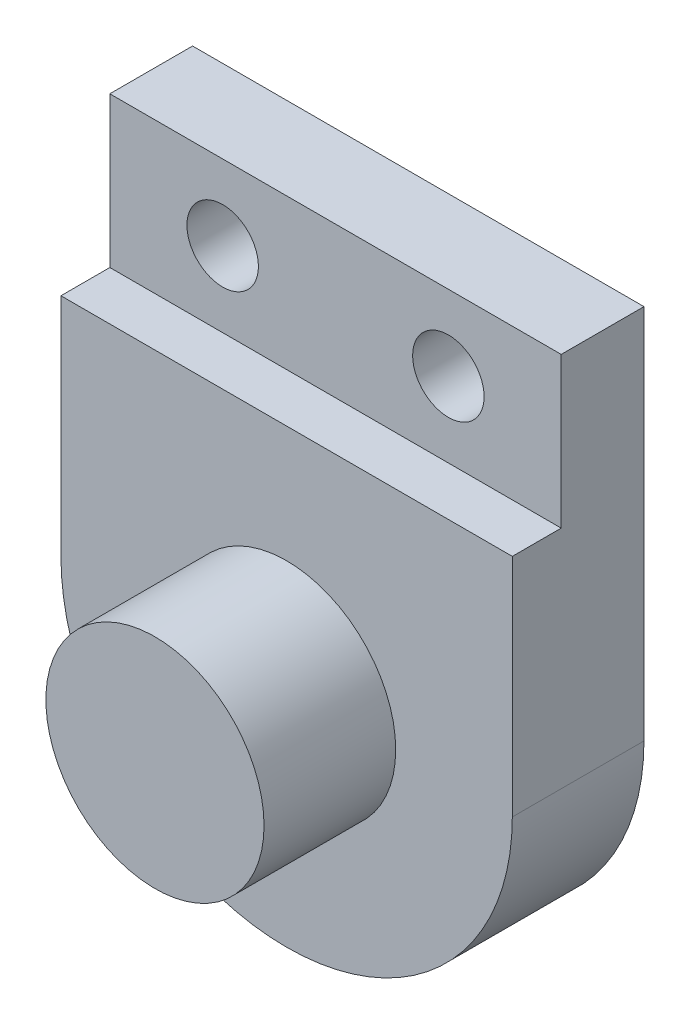
ISO-10303-21;
HEADER;
FILE_DESCRIPTION(('STEP AP214'),'2;1');
FILE_NAME('part.step','',(''),(''),'','','');
FILE_SCHEMA(('AUTOMOTIVE_DESIGN { 1 0 10303 214 1 1 1 1 }'));
ENDSEC;
DATA;
#1=APPLICATION_CONTEXT('core data for automotive mechanical design processes');
#2=APPLICATION_PROTOCOL_DEFINITION('international standard','automotive_design',2000,#1);
#3=PRODUCT_CONTEXT('',#1,'mechanical');
#4=PRODUCT('Part','Part','',(#3));
#5=PRODUCT_RELATED_PRODUCT_CATEGORY('part','',(#4));
#6=PRODUCT_DEFINITION_FORMATION('','',#4);
#7=PRODUCT_DEFINITION_CONTEXT('part definition',#1,'design');
#8=PRODUCT_DEFINITION('design','',#6,#7);
#9=PRODUCT_DEFINITION_SHAPE('','',#8);
#10=(LENGTH_UNIT() NAMED_UNIT(*) SI_UNIT(.MILLI.,.METRE.));
#11=(NAMED_UNIT(*) PLANE_ANGLE_UNIT() SI_UNIT($,.RADIAN.));
#12=(NAMED_UNIT(*) SI_UNIT($,.STERADIAN.) SOLID_ANGLE_UNIT());
#13=UNCERTAINTY_MEASURE_WITH_UNIT(LENGTH_MEASURE(1.E-05),#10,'distance_accuracy_value','');
#14=(GEOMETRIC_REPRESENTATION_CONTEXT(3) GLOBAL_UNCERTAINTY_ASSIGNED_CONTEXT((#13)) GLOBAL_UNIT_ASSIGNED_CONTEXT((#10,
#11,#12)) REPRESENTATION_CONTEXT('',''));
#15=CARTESIAN_POINT('',(0.,0.,0.));
#16=DIRECTION('',(0.,0.,1.));
#17=DIRECTION('',(1.,0.,0.));
#18=AXIS2_PLACEMENT_3D('',#15,#16,#17);
#19=CARTESIAN_POINT('',(3.,2.,2.2));
#20=DIRECTION('',(0.,0.,-1.));
#21=DIRECTION('',(-1.,0.,0.));
#22=AXIS2_PLACEMENT_3D('',#19,#20,#21);
#23=CYLINDRICAL_SURFACE('',#22,0.95);
#24=CARTESIAN_POINT('',(3.,2.,2.2));
#25=DIRECTION('',(0.,0.,1.));
#26=DIRECTION('',(1.,0.,0.));
#27=AXIS2_PLACEMENT_3D('',#24,#25,#26);
#28=CIRCLE('',#27,0.95);
#29=CARTESIAN_POINT('',(3.95,2.,2.2));
#30=VERTEX_POINT('',#29);
#31=EDGE_CURVE('E151',#30,#30,#28,.T.);
#32=ORIENTED_EDGE('',*,*,#31,.T.);
#33=EDGE_LOOP('',(#32));
#34=FACE_BOUND('',#33,.T.);
#35=CARTESIAN_POINT('',(3.,2.,0.3));
#36=DIRECTION('',(0.,0.,-1.));
#37=DIRECTION('',(-1.,0.,0.));
#38=AXIS2_PLACEMENT_3D('',#35,#36,#37);
#39=CIRCLE('',#38,0.95);
#40=CARTESIAN_POINT('',(2.05,2.,0.3));
#41=VERTEX_POINT('',#40);
#42=EDGE_CURVE('E167',#41,#41,#39,.T.);
#43=ORIENTED_EDGE('',*,*,#42,.T.);
#44=EDGE_LOOP('',(#43));
#45=FACE_BOUND('',#44,.T.);
#46=ADVANCED_FACE('F37',(#34,#45),#23,.F.);
#47=CARTESIAN_POINT('',(9.,2.,2.2));
#48=DIRECTION('',(0.,0.,-1.));
#49=DIRECTION('',(-1.,0.,0.));
#50=AXIS2_PLACEMENT_3D('',#47,#48,#49);
#51=CYLINDRICAL_SURFACE('',#50,0.949999999999999);
#52=CARTESIAN_POINT('',(9.,2.,2.2));
#53=DIRECTION('',(0.,0.,1.));
#54=DIRECTION('',(1.,0.,0.));
#55=AXIS2_PLACEMENT_3D('',#52,#53,#54);
#56=CIRCLE('',#55,0.949999999999999);
#57=CARTESIAN_POINT('',(9.95,2.,2.2));
#58=VERTEX_POINT('',#57);
#59=EDGE_CURVE('E148',#58,#58,#56,.T.);
#60=ORIENTED_EDGE('',*,*,#59,.T.);
#61=EDGE_LOOP('',(#60));
#62=FACE_BOUND('',#61,.T.);
#63=CARTESIAN_POINT('',(9.,2.,0.3));
#64=DIRECTION('',(0.,0.,-1.));
#65=DIRECTION('',(-1.,0.,0.));
#66=AXIS2_PLACEMENT_3D('',#63,#64,#65);
#67=CIRCLE('',#66,0.949999999999999);
#68=CARTESIAN_POINT('',(8.05,2.,0.3));
#69=VERTEX_POINT('',#68);
#70=EDGE_CURVE('E138',#69,#69,#67,.T.);
#71=ORIENTED_EDGE('',*,*,#70,.T.);
#72=EDGE_LOOP('',(#71));
#73=FACE_BOUND('',#72,.T.);
#74=ADVANCED_FACE('F241',(#62,#73),#51,.F.);
#75=CARTESIAN_POINT('',(12.,0.,3.));
#76=DIRECTION('',(1.,0.,0.));
#77=DIRECTION('',(0.,0.,-1.));
#78=AXIS2_PLACEMENT_3D('',#75,#76,#77);
#79=PLANE('',#78);
#80=DIRECTION('',(0.,-1.,0.));
#81=VECTOR('',#80,1.);
#82=CARTESIAN_POINT('',(12.,0.,0.));
#83=LINE('',#82,#81);
#84=CARTESIAN_POINT('',(12.,4.,0.));
#85=VERTEX_POINT('',#84);
#86=CARTESIAN_POINT('',(12.,-6.,0.));
#87=VERTEX_POINT('',#86);
#88=EDGE_CURVE('E178',#85,#87,#83,.T.);
#89=ORIENTED_EDGE('',*,*,#88,.F.);
#90=DIRECTION('',(0.,0.,-1.));
#91=VECTOR('',#90,1.);
#92=CARTESIAN_POINT('',(12.,4.,2.2));
#93=LINE('',#92,#91);
#94=CARTESIAN_POINT('',(12.,4.,2.2));
#95=VERTEX_POINT('',#94);
#96=EDGE_CURVE('E164',#95,#85,#93,.T.);
#97=ORIENTED_EDGE('',*,*,#96,.F.);
#98=DIRECTION('',(0.,1.,0.));
#99=VECTOR('',#98,1.);
#100=CARTESIAN_POINT('',(12.,0.,2.2));
#101=LINE('',#100,#99);
#102=CARTESIAN_POINT('',(12.,0.,2.2));
#103=VERTEX_POINT('',#102);
#104=EDGE_CURVE('E162',#103,#95,#101,.T.);
#105=ORIENTED_EDGE('',*,*,#104,.F.);
#106=DIRECTION('',(0.,0.,-1.));
#107=VECTOR('',#106,1.);
#108=CARTESIAN_POINT('',(12.,0.,3.));
#109=LINE('',#108,#107);
#110=CARTESIAN_POINT('',(12.,0.,3.5));
#111=VERTEX_POINT('',#110);
#112=EDGE_CURVE('E46',#111,#103,#109,.T.);
#113=ORIENTED_EDGE('',*,*,#112,.F.);
#114=DIRECTION('',(-6.94443962403867E-07,0.999999999999759,0.));
#115=VECTOR('',#114,1.);
#116=CARTESIAN_POINT('',(12.,0.,3.5));
#117=LINE('',#116,#115);
#118=CARTESIAN_POINT('',(12.0000041666638,-6.,3.5));
#119=VERTEX_POINT('',#118);
#120=EDGE_CURVE('E122',#119,#111,#117,.T.);
#121=ORIENTED_EDGE('',*,*,#120,.F.);
#122=DIRECTION('',(0.,0.,-1.));
#123=VECTOR('',#122,1.);
#124=CARTESIAN_POINT('',(12.,-6.,3.));
#125=LINE('',#124,#123);
#126=EDGE_CURVE('E11',#119,#87,#125,.T.);
#127=ORIENTED_EDGE('',*,*,#126,.T.);
#128=EDGE_LOOP('',(#89,#97,#105,#113,#121,#127));
#129=FACE_BOUND('',#128,.T.);
#130=ADVANCED_FACE('F39',(#129),#79,.T.);
#131=CARTESIAN_POINT('',(0.,0.,3.));
#132=DIRECTION('',(0.,1.,0.));
#133=DIRECTION('',(0.,0.,1.));
#134=AXIS2_PLACEMENT_3D('',#131,#132,#133);
#135=PLANE('',#134);
#136=DIRECTION('',(1.,0.,0.));
#137=VECTOR('',#136,1.);
#138=CARTESIAN_POINT('',(0.,0.,2.2));
#139=LINE('',#138,#137);
#140=CARTESIAN_POINT('',(0.,0.,2.2));
#141=VERTEX_POINT('',#140);
#142=EDGE_CURVE('E54',#141,#103,#139,.T.);
#143=ORIENTED_EDGE('',*,*,#142,.F.);
#144=DIRECTION('',(0.,0.,-1.));
#145=VECTOR('',#144,1.);
#146=CARTESIAN_POINT('',(0.,0.,3.));
#147=LINE('',#146,#145);
#148=CARTESIAN_POINT('',(0.,0.,3.5));
#149=VERTEX_POINT('',#148);
#150=EDGE_CURVE('E113',#149,#141,#147,.T.);
#151=ORIENTED_EDGE('',*,*,#150,.F.);
#152=DIRECTION('',(-1.,0.,0.));
#153=VECTOR('',#152,1.);
#154=CARTESIAN_POINT('',(0.,0.,3.5));
#155=LINE('',#154,#153);
#156=EDGE_CURVE('E127',#111,#149,#155,.T.);
#157=ORIENTED_EDGE('',*,*,#156,.F.);
#158=ORIENTED_EDGE('',*,*,#112,.T.);
#159=EDGE_LOOP('',(#143,#151,#157,#158));
#160=FACE_BOUND('',#159,.T.);
#161=ADVANCED_FACE('F223',(#160),#135,.T.);
#162=CARTESIAN_POINT('',(0.,0.,3.));
#163=DIRECTION('',(-1.,0.,0.));
#164=DIRECTION('',(0.,-1.,0.));
#165=AXIS2_PLACEMENT_3D('',#162,#163,#164);
#166=PLANE('',#165);
#167=DIRECTION('',(0.,1.,0.));
#168=VECTOR('',#167,1.);
#169=CARTESIAN_POINT('',(0.,0.,0.));
#170=LINE('',#169,#168);
#171=CARTESIAN_POINT('',(0.,-5.99999999999996,0.));
#172=VERTEX_POINT('',#171);
#173=CARTESIAN_POINT('',(0.,4.,0.));
#174=VERTEX_POINT('',#173);
#175=EDGE_CURVE('E110',#172,#174,#170,.T.);
#176=ORIENTED_EDGE('',*,*,#175,.F.);
#177=DIRECTION('',(0.,0.,-1.));
#178=VECTOR('',#177,1.);
#179=CARTESIAN_POINT('',(0.,-5.99999999999996,3.));
#180=LINE('',#179,#178);
#181=CARTESIAN_POINT('',(-2.08333188547738E-06,-5.99999999999996,3.5));
#182=VERTEX_POINT('',#181);
#183=EDGE_CURVE('E104',#182,#172,#180,.T.);
#184=ORIENTED_EDGE('',*,*,#183,.F.);
#185=DIRECTION('',(0.,-1.,0.));
#186=VECTOR('',#185,1.);
#187=CARTESIAN_POINT('',(0.,0.,3.5));
#188=LINE('',#187,#186);
#189=EDGE_CURVE('E108',#149,#182,#188,.T.);
#190=ORIENTED_EDGE('',*,*,#189,.F.);
#191=ORIENTED_EDGE('',*,*,#150,.T.);
#192=DIRECTION('',(0.,-1.,0.));
#193=VECTOR('',#192,1.);
#194=CARTESIAN_POINT('',(0.,0.,2.2));
#195=LINE('',#194,#193);
#196=CARTESIAN_POINT('',(0.,4.,2.2));
#197=VERTEX_POINT('',#196);
#198=EDGE_CURVE('E158',#197,#141,#195,.T.);
#199=ORIENTED_EDGE('',*,*,#198,.F.);
#200=DIRECTION('',(0.,0.,-1.));
#201=VECTOR('',#200,1.);
#202=CARTESIAN_POINT('',(0.,4.,2.2));
#203=LINE('',#202,#201);
#204=EDGE_CURVE('E170',#197,#174,#203,.T.);
#205=ORIENTED_EDGE('',*,*,#204,.T.);
#206=EDGE_LOOP('',(#176,#184,#190,#191,#199,#205));
#207=FACE_BOUND('',#206,.T.);
#208=ADVANCED_FACE('F106',(#207),#166,.T.);
#209=CARTESIAN_POINT('',(6.,-6.,3.));
#210=DIRECTION('',(0.,0.,-1.));
#211=DIRECTION('',(-1.,0.,0.));
#212=AXIS2_PLACEMENT_3D('',#209,#210,#211);
#213=CYLINDRICAL_SURFACE('',#212,6.);
#214=CARTESIAN_POINT('',(6.,-6.,0.));
#215=DIRECTION('',(0.,0.,1.));
#216=DIRECTION('',(1.,0.,0.));
#217=AXIS2_PLACEMENT_3D('',#214,#215,#216);
#218=CIRCLE('',#217,6.);
#219=CARTESIAN_POINT('',(6.00000000000005,-12.,0.));
#220=VERTEX_POINT('',#219);
#221=EDGE_CURVE('E179',#220,#172,#218,.F.);
#222=ORIENTED_EDGE('',*,*,#221,.F.);
#223=DIRECTION('',(0.,0.,-1.));
#224=VECTOR('',#223,1.);
#225=CARTESIAN_POINT('',(6.00000000000005,-12.,3.));
#226=LINE('',#225,#224);
#227=CARTESIAN_POINT('',(6.00000000000005,-12.0000020833319,3.));
#228=VERTEX_POINT('',#227);
#229=EDGE_CURVE('E114',#228,#220,#226,.T.);
#230=ORIENTED_EDGE('',*,*,#229,.F.);
#231=DIRECTION('',(-1.,0.,0.));
#232=VECTOR('',#231,1.);
#233=CARTESIAN_POINT('',(0.,-12.,3.));
#234=LINE('',#233,#232);
#235=CARTESIAN_POINT('',(6.00999998958331,-11.999993750013,3.));
#236=VERTEX_POINT('',#235);
#237=EDGE_CURVE('E173',#236,#228,#234,.T.);
#238=ORIENTED_EDGE('',*,*,#237,.F.);
#239=DIRECTION('',(0.,0.,-1.));
#240=VECTOR('',#239,1.);
#241=CARTESIAN_POINT('',(6.00999999999996,-12.,3.));
#242=LINE('',#241,#240);
#243=CARTESIAN_POINT('',(6.00999999999996,-12.,0.));
#244=VERTEX_POINT('',#243);
#245=EDGE_CURVE('E62',#236,#244,#242,.T.);
#246=ORIENTED_EDGE('',*,*,#245,.T.);
#247=EDGE_CURVE('E172',#87,#244,#218,.F.);
#248=ORIENTED_EDGE('',*,*,#247,.F.);
#249=ORIENTED_EDGE('',*,*,#126,.F.);
#250=CARTESIAN_POINT('',(6.,-6.,3.5));
#251=DIRECTION('',(0.,0.,1.));
#252=DIRECTION('',(1.,0.,0.));
#253=AXIS2_PLACEMENT_3D('',#250,#251,#252);
#254=CIRCLE('',#253,6.00000208333189);
#255=EDGE_CURVE('E117',#182,#119,#254,.T.);
#256=ORIENTED_EDGE('',*,*,#255,.F.);
#257=ORIENTED_EDGE('',*,*,#183,.T.);
#258=EDGE_LOOP('',(#222,#230,#238,#246,#248,#249,#256,#257));
#259=FACE_BOUND('',#258,.T.);
#260=ADVANCED_FACE('F118',(#259),#213,.T.);
#261=CARTESIAN_POINT('',(0.,-12.,3.));
#262=DIRECTION('',(0.,-1.,0.));
#263=DIRECTION('',(0.,0.,-1.));
#264=AXIS2_PLACEMENT_3D('',#261,#262,#263);
#265=PLANE('',#264);
#266=DIRECTION('',(-1.,0.,0.));
#267=VECTOR('',#266,1.);
#268=CARTESIAN_POINT('',(0.,-12.,0.));
#269=LINE('',#268,#267);
#270=EDGE_CURVE('E176',#244,#220,#269,.T.);
#271=ORIENTED_EDGE('',*,*,#270,.F.);
#272=ORIENTED_EDGE('',*,*,#245,.F.);
#273=ORIENTED_EDGE('',*,*,#237,.T.);
#274=ORIENTED_EDGE('',*,*,#229,.T.);
#275=EDGE_LOOP('',(#271,#272,#273,#274));
#276=FACE_BOUND('',#275,.T.);
#277=ADVANCED_FACE('F211',(#276),#265,.T.);
#278=CARTESIAN_POINT('',(0.,0.,0.));
#279=DIRECTION('',(0.,0.,1.));
#280=DIRECTION('',(1.,0.,0.));
#281=AXIS2_PLACEMENT_3D('',#278,#279,#280);
#282=PLANE('',#281);
#283=CARTESIAN_POINT('',(9.,2.,0.));
#284=DIRECTION('',(0.,0.,-1.));
#285=DIRECTION('',(-1.,0.,0.));
#286=AXIS2_PLACEMENT_3D('',#283,#284,#285);
#287=CIRCLE('',#286,1.85);
#288=CARTESIAN_POINT('',(7.15,2.,0.));
#289=VERTEX_POINT('',#288);
#290=EDGE_CURVE('E139',#289,#289,#287,.T.);
#291=ORIENTED_EDGE('',*,*,#290,.F.);
#292=EDGE_LOOP('',(#291));
#293=FACE_BOUND('',#292,.T.);
#294=CARTESIAN_POINT('',(3.,2.,0.));
#295=DIRECTION('',(0.,0.,-1.));
#296=DIRECTION('',(-1.,0.,0.));
#297=AXIS2_PLACEMENT_3D('',#294,#295,#296);
#298=CIRCLE('',#297,1.85);
#299=CARTESIAN_POINT('',(1.15,2.,0.));
#300=VERTEX_POINT('',#299);
#301=EDGE_CURVE('E145',#300,#300,#298,.T.);
#302=ORIENTED_EDGE('',*,*,#301,.F.);
#303=EDGE_LOOP('',(#302));
#304=FACE_BOUND('',#303,.T.);
#305=ORIENTED_EDGE('',*,*,#247,.T.);
#306=ORIENTED_EDGE('',*,*,#270,.T.);
#307=ORIENTED_EDGE('',*,*,#221,.T.);
#308=ORIENTED_EDGE('',*,*,#175,.T.);
#309=DIRECTION('',(-1.,0.,0.));
#310=VECTOR('',#309,1.);
#311=CARTESIAN_POINT('',(0.,4.,0.));
#312=LINE('',#311,#310);
#313=EDGE_CURVE('E152',#85,#174,#312,.T.);
#314=ORIENTED_EDGE('',*,*,#313,.F.);
#315=ORIENTED_EDGE('',*,*,#88,.T.);
#316=EDGE_LOOP('',(#305,#306,#307,#308,#314,#315));
#317=FACE_BOUND('',#316,.T.);
#318=ADVANCED_FACE('F207',(#293,#304,#317),#282,.F.);
#319=CARTESIAN_POINT('',(0.,4.,2.2));
#320=DIRECTION('',(0.,-1.,0.));
#321=DIRECTION('',(0.,0.,-1.));
#322=AXIS2_PLACEMENT_3D('',#319,#320,#321);
#323=PLANE('',#322);
#324=ORIENTED_EDGE('',*,*,#313,.T.);
#325=ORIENTED_EDGE('',*,*,#204,.F.);
#326=DIRECTION('',(-1.,0.,0.));
#327=VECTOR('',#326,1.);
#328=CARTESIAN_POINT('',(0.,4.,2.2));
#329=LINE('',#328,#327);
#330=EDGE_CURVE('E155',#95,#197,#329,.T.);
#331=ORIENTED_EDGE('',*,*,#330,.F.);
#332=ORIENTED_EDGE('',*,*,#96,.T.);
#333=EDGE_LOOP('',(#324,#325,#331,#332));
#334=FACE_BOUND('',#333,.T.);
#335=ADVANCED_FACE('F210',(#334),#323,.F.);
#336=CARTESIAN_POINT('',(0.,0.,2.2));
#337=DIRECTION('',(0.,0.,1.));
#338=DIRECTION('',(1.,0.,0.));
#339=AXIS2_PLACEMENT_3D('',#336,#337,#338);
#340=PLANE('',#339);
#341=ORIENTED_EDGE('',*,*,#59,.F.);
#342=EDGE_LOOP('',(#341));
#343=FACE_BOUND('',#342,.T.);
#344=ORIENTED_EDGE('',*,*,#31,.F.);
#345=EDGE_LOOP('',(#344));
#346=FACE_BOUND('',#345,.T.);
#347=ORIENTED_EDGE('',*,*,#330,.T.);
#348=ORIENTED_EDGE('',*,*,#198,.T.);
#349=ORIENTED_EDGE('',*,*,#142,.T.);
#350=ORIENTED_EDGE('',*,*,#104,.T.);
#351=EDGE_LOOP('',(#347,#348,#349,#350));
#352=FACE_BOUND('',#351,.T.);
#353=ADVANCED_FACE('F225',(#343,#346,#352),#340,.T.);
#354=CARTESIAN_POINT('',(9.,2.,0.3));
#355=DIRECTION('',(0.,0.,-1.));
#356=DIRECTION('',(-1.,0.,0.));
#357=AXIS2_PLACEMENT_3D('',#354,#355,#356);
#358=CYLINDRICAL_SURFACE('',#357,1.85);
#359=CARTESIAN_POINT('',(9.,2.,0.3));
#360=DIRECTION('',(0.,0.,-1.));
#361=DIRECTION('',(-1.,0.,0.));
#362=AXIS2_PLACEMENT_3D('',#359,#360,#361);
#363=CIRCLE('',#362,1.85);
#364=CARTESIAN_POINT('',(7.15,2.,0.3));
#365=VERTEX_POINT('',#364);
#366=EDGE_CURVE('E135',#365,#365,#363,.T.);
#367=ORIENTED_EDGE('',*,*,#366,.F.);
#368=EDGE_LOOP('',(#367));
#369=FACE_BOUND('',#368,.T.);
#370=ORIENTED_EDGE('',*,*,#290,.T.);
#371=EDGE_LOOP('',(#370));
#372=FACE_BOUND('',#371,.T.);
#373=ADVANCED_FACE('F227',(#369,#372),#358,.F.);
#374=CARTESIAN_POINT('',(9.,2.,0.3));
#375=DIRECTION('',(0.,0.,-1.));
#376=DIRECTION('',(-1.,0.,0.));
#377=AXIS2_PLACEMENT_3D('',#374,#375,#376);
#378=PLANE('',#377);
#379=ORIENTED_EDGE('',*,*,#70,.F.);
#380=EDGE_LOOP('',(#379));
#381=FACE_BOUND('',#380,.T.);
#382=ORIENTED_EDGE('',*,*,#366,.T.);
#383=EDGE_LOOP('',(#382));
#384=FACE_BOUND('',#383,.T.);
#385=ADVANCED_FACE('F203',(#381,#384),#378,.T.);
#386=CARTESIAN_POINT('',(3.,2.,0.3));
#387=DIRECTION('',(0.,0.,-1.));
#388=DIRECTION('',(-1.,0.,0.));
#389=AXIS2_PLACEMENT_3D('',#386,#387,#388);
#390=CYLINDRICAL_SURFACE('',#389,1.85);
#391=CARTESIAN_POINT('',(3.,2.,0.3));
#392=DIRECTION('',(0.,0.,-1.));
#393=DIRECTION('',(-1.,0.,0.));
#394=AXIS2_PLACEMENT_3D('',#391,#392,#393);
#395=CIRCLE('',#394,1.85);
#396=CARTESIAN_POINT('',(1.15,2.,0.3));
#397=VERTEX_POINT('',#396);
#398=EDGE_CURVE('E142',#397,#397,#395,.T.);
#399=ORIENTED_EDGE('',*,*,#398,.F.);
#400=EDGE_LOOP('',(#399));
#401=FACE_BOUND('',#400,.T.);
#402=ORIENTED_EDGE('',*,*,#301,.T.);
#403=EDGE_LOOP('',(#402));
#404=FACE_BOUND('',#403,.T.);
#405=ADVANCED_FACE('F197',(#401,#404),#390,.F.);
#406=CARTESIAN_POINT('',(3.,2.,0.3));
#407=DIRECTION('',(0.,0.,-1.));
#408=DIRECTION('',(-1.,0.,0.));
#409=AXIS2_PLACEMENT_3D('',#406,#407,#408);
#410=PLANE('',#409);
#411=ORIENTED_EDGE('',*,*,#42,.F.);
#412=EDGE_LOOP('',(#411));
#413=FACE_BOUND('',#412,.T.);
#414=ORIENTED_EDGE('',*,*,#398,.T.);
#415=EDGE_LOOP('',(#414));
#416=FACE_BOUND('',#415,.T.);
#417=ADVANCED_FACE('F194',(#413,#416),#410,.T.);
#418=CARTESIAN_POINT('',(6.,-6.,3.5));
#419=DIRECTION('',(0.,0.,1.));
#420=DIRECTION('',(1.,0.,0.));
#421=AXIS2_PLACEMENT_3D('',#418,#419,#420);
#422=PLANE('',#421);
#423=CARTESIAN_POINT('',(6.,-6.,3.5));
#424=DIRECTION('',(0.,0.,1.));
#425=DIRECTION('',(1.,0.,0.));
#426=AXIS2_PLACEMENT_3D('',#423,#424,#425);
#427=CIRCLE('',#426,2.9);
#428=CARTESIAN_POINT('',(8.9,-6.,3.5));
#429=VERTEX_POINT('',#428);
#430=EDGE_CURVE('E41',#429,#429,#427,.T.);
#431=ORIENTED_EDGE('',*,*,#430,.F.);
#432=EDGE_LOOP('',(#431));
#433=FACE_BOUND('',#432,.T.);
#434=ORIENTED_EDGE('',*,*,#189,.T.);
#435=ORIENTED_EDGE('',*,*,#255,.T.);
#436=ORIENTED_EDGE('',*,*,#120,.T.);
#437=ORIENTED_EDGE('',*,*,#156,.T.);
#438=EDGE_LOOP('',(#434,#435,#436,#437));
#439=FACE_BOUND('',#438,.T.);
#440=ADVANCED_FACE('F125',(#433,#439),#422,.T.);
#441=CARTESIAN_POINT('',(6.,-6.,6.));
#442=DIRECTION('',(0.,0.,-1.));
#443=DIRECTION('',(-1.,0.,0.));
#444=AXIS2_PLACEMENT_3D('',#441,#442,#443);
#445=CYLINDRICAL_SURFACE('',#444,2.9);
#446=ORIENTED_EDGE('',*,*,#430,.T.);
#447=EDGE_LOOP('',(#446));
#448=FACE_BOUND('',#447,.T.);
#449=CARTESIAN_POINT('',(6.,-6.,7.));
#450=DIRECTION('',(0.,0.,1.));
#451=DIRECTION('',(1.,0.,0.));
#452=AXIS2_PLACEMENT_3D('',#449,#450,#451);
#453=CIRCLE('',#452,2.9);
#454=CARTESIAN_POINT('',(8.9,-6.,7.));
#455=VERTEX_POINT('',#454);
#456=EDGE_CURVE('E128',#455,#455,#453,.T.);
#457=ORIENTED_EDGE('',*,*,#456,.F.);
#458=EDGE_LOOP('',(#457));
#459=FACE_BOUND('',#458,.T.);
#460=ADVANCED_FACE('F304',(#448,#459),#445,.T.);
#461=CARTESIAN_POINT('',(0.,0.,7.));
#462=DIRECTION('',(0.,0.,1.));
#463=DIRECTION('',(1.,0.,0.));
#464=AXIS2_PLACEMENT_3D('',#461,#462,#463);
#465=PLANE('',#464);
#466=ORIENTED_EDGE('',*,*,#456,.T.);
#467=EDGE_LOOP('',(#466));
#468=FACE_BOUND('',#467,.T.);
#469=ADVANCED_FACE('F314',(#468),#465,.T.);
#470=CLOSED_SHELL('',(#46,#74,#130,#161,#208,#260,#277,#318,#335,#353,#373,#385,#405,#417,#440,
#460,#469));
#471=MANIFOLD_SOLID_BREP('B2',#470);
#472=ADVANCED_BREP_SHAPE_REPRESENTATION('',(#18,#471),#14);
#473=SHAPE_DEFINITION_REPRESENTATION(#9,#472);
ENDSEC;
END-ISO-10303-21;
